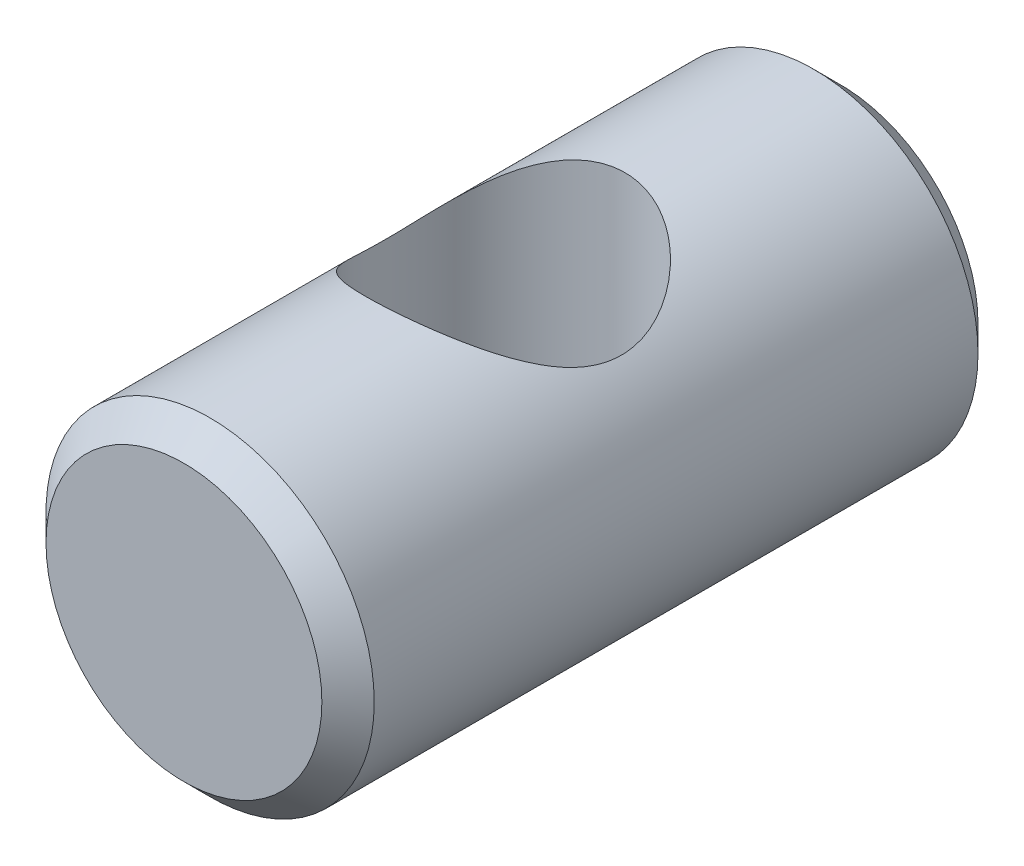
ISO-10303-21;
HEADER;
FILE_DESCRIPTION(('STEP AP214'),'2;1');
FILE_NAME('part.step','',(''),(''),'','','');
FILE_SCHEMA(('AUTOMOTIVE_DESIGN { 1 0 10303 214 1 1 1 1 }'));
ENDSEC;
DATA;
#1=APPLICATION_CONTEXT('core data for automotive mechanical design processes');
#2=APPLICATION_PROTOCOL_DEFINITION('international standard','automotive_design',2000,#1);
#3=PRODUCT_CONTEXT('',#1,'mechanical');
#4=PRODUCT('Part','Part','',(#3));
#5=PRODUCT_RELATED_PRODUCT_CATEGORY('part','',(#4));
#6=PRODUCT_DEFINITION_FORMATION('','',#4);
#7=PRODUCT_DEFINITION_CONTEXT('part definition',#1,'design');
#8=PRODUCT_DEFINITION('design','',#6,#7);
#9=PRODUCT_DEFINITION_SHAPE('','',#8);
#10=(LENGTH_UNIT() NAMED_UNIT(*) SI_UNIT(.MILLI.,.METRE.));
#11=(NAMED_UNIT(*) PLANE_ANGLE_UNIT() SI_UNIT($,.RADIAN.));
#12=(NAMED_UNIT(*) SI_UNIT($,.STERADIAN.) SOLID_ANGLE_UNIT());
#13=UNCERTAINTY_MEASURE_WITH_UNIT(LENGTH_MEASURE(1.E-05),#10,'distance_accuracy_value','');
#14=(GEOMETRIC_REPRESENTATION_CONTEXT(3) GLOBAL_UNCERTAINTY_ASSIGNED_CONTEXT((#13)) GLOBAL_UNIT_ASSIGNED_CONTEXT((#10,
#11,#12)) REPRESENTATION_CONTEXT('',''));
#15=CARTESIAN_POINT('',(0.,0.,0.));
#16=DIRECTION('',(0.,0.,1.));
#17=DIRECTION('',(1.,0.,0.));
#18=AXIS2_PLACEMENT_3D('',#15,#16,#17);
#19=CARTESIAN_POINT('',(0.,0.,9.525));
#20=DIRECTION('',(0.,0.,-1.));
#21=DIRECTION('',(-1.,0.,0.));
#22=AXIS2_PLACEMENT_3D('',#19,#20,#21);
#23=CYLINDRICAL_SURFACE('',#22,4.765);
#24=CARTESIAN_POINT('',(0.,0.,-8.76499999999998));
#25=DIRECTION('',(0.,0.,1.));
#26=DIRECTION('',(1.,0.,0.));
#27=AXIS2_PLACEMENT_3D('',#24,#25,#26);
#28=CIRCLE('',#27,4.765);
#29=CARTESIAN_POINT('',(4.765,0.,-8.76499999999998));
#30=VERTEX_POINT('',#29);
#31=EDGE_CURVE('E47',#30,#30,#28,.T.);
#32=ORIENTED_EDGE('',*,*,#31,.T.);
#33=EDGE_LOOP('',(#32));
#34=FACE_BOUND('',#33,.T.);
#35=CARTESIAN_POINT('',(0.,0.,8.76500000000001));
#36=DIRECTION('',(0.,0.,1.));
#37=DIRECTION('',(1.,0.,0.));
#38=AXIS2_PLACEMENT_3D('',#35,#36,#37);
#39=CIRCLE('',#38,4.765);
#40=CARTESIAN_POINT('',(4.765,0.,8.76500000000001));
#41=VERTEX_POINT('',#40);
#42=EDGE_CURVE('E51',#41,#41,#39,.F.);
#43=ORIENTED_EDGE('',*,*,#42,.T.);
#44=EDGE_LOOP('',(#43));
#45=FACE_BOUND('',#44,.T.);
#46=CARTESIAN_POINT('',(0.,-4.765,-3.42087708051605));
#47=CARTESIAN_POINT('',(-0.0833627581168181,-4.7649997101109,-3.42696899134863));
#48=CARTESIAN_POINT('',(-0.166953392424251,-4.76280757869707,-3.43001003086423));
#49=CARTESIAN_POINT('',(-0.333933182408652,-4.75402028790231,-3.4299899120654));
#50=CARTESIAN_POINT('',(-0.41732223719261,-4.74742325494959,-3.42692615604904));
#51=CARTESIAN_POINT('',(-0.583312250165056,-4.72989865727235,-3.41478160746824));
#52=CARTESIAN_POINT('',(-0.665912068503747,-4.71896558414041,-3.40569315136156));
#53=CARTESIAN_POINT('',(-0.829610597514771,-4.69295834085159,-3.38168739143667));
#54=CARTESIAN_POINT('',(-0.91070865358331,-4.67788240819801,-3.36676760565251));
#55=CARTESIAN_POINT('',(-1.15000632689336,-4.62699847385246,-3.31382161536753));
#56=CARTESIAN_POINT('',(-1.30524951697123,-4.58542013528299,-3.26752778272676));
#57=CARTESIAN_POINT('',(-1.60411463212557,-4.48962808746058,-3.15544383432779));
#58=CARTESIAN_POINT('',(-1.74773682156028,-4.43541466574349,-3.08965416222603));
#59=CARTESIAN_POINT('',(-2.03259497643689,-4.31273538578719,-2.93522566350036));
#60=CARTESIAN_POINT('',(-2.17272279857911,-4.24347672491827,-2.84518090003159));
#61=CARTESIAN_POINT('',(-2.43631552731587,-4.09784606286129,-2.64803347355049));
#62=CARTESIAN_POINT('',(-2.55976291960052,-4.02146672501527,-2.54091313456509));
#63=CARTESIAN_POINT('',(-2.81327393100644,-3.84950291536883,-2.28757037498761));
#64=CARTESIAN_POINT('',(-2.93940806717613,-3.75321839663728,-2.13784494064544));
#65=CARTESIAN_POINT('',(-3.10885207016274,-3.61188607024724,-1.89774924473951));
#66=CARTESIAN_POINT('',(-3.16205944901992,-3.56527135977744,-1.81509327318893));
#67=CARTESIAN_POINT('',(-3.26165283895997,-3.47438917550769,-1.64456461914389));
#68=CARTESIAN_POINT('',(-3.30804141803447,-3.43012082209569,-1.55669391813204));
#69=CARTESIAN_POINT('',(-3.41144333221737,-3.32784018306176,-1.33801732923479));
#70=CARTESIAN_POINT('',(-3.46485738281701,-3.27176419567389,-1.20454764001565));
#71=CARTESIAN_POINT('',(-3.55539465585279,-3.1731532714438,-0.927567219273259));
#72=CARTESIAN_POINT('',(-3.59255605597934,-3.13058666617785,-0.784080947165172));
#73=CARTESIAN_POINT('',(-3.64343651296181,-3.07113542283653,-0.514646140223208));
#74=CARTESIAN_POINT('',(-3.66010628533956,-3.05107413064414,-0.389980532152302));
#75=CARTESIAN_POINT('',(-3.67954153570878,-3.02761567970702,-0.138051441971629));
#76=CARTESIAN_POINT('',(-3.68232117171679,-3.02420155283186,-0.0107907379518645));
#77=CARTESIAN_POINT('',(-3.67376621747767,-3.03458366659267,0.242449329866107));
#78=CARTESIAN_POINT('',(-3.66243797397314,-3.04837216824954,0.36842924415841));
#79=CARTESIAN_POINT('',(-3.62657095184853,-3.09094772918142,0.615927376424318));
#80=CARTESIAN_POINT('',(-3.60201250089043,-3.11975712134959,0.737438661719832));
#81=CARTESIAN_POINT('',(-3.52797021750044,-3.20358122773375,1.02486117239319));
#82=CARTESIAN_POINT('',(-3.47231020523667,-3.26453704351351,1.18741075414518));
#83=CARTESIAN_POINT('',(-3.34017866781708,-3.39961296516166,1.498121783823));
#84=CARTESIAN_POINT('',(-3.2636446149314,-3.47377238661047,1.64623815847782));
#85=CARTESIAN_POINT('',(-3.12200897105521,-3.60054284241464,1.87825971607124));
#86=CARTESIAN_POINT('',(-3.06234750531042,-3.65156363596669,1.9664324955114));
#87=CARTESIAN_POINT('',(-2.93536296354977,-3.75440484501345,2.13658829521524));
#88=CARTESIAN_POINT('',(-2.86803758566651,-3.80622549668558,2.21856944344932));
#89=CARTESIAN_POINT('',(-2.65493557738645,-3.96070606463684,2.4548169203279));
#90=CARTESIAN_POINT('',(-2.4978237985218,-4.06258137631192,2.59972905493882));
#91=CARTESIAN_POINT('',(-2.18575837138568,-4.23718725327564,2.83706621766583));
#92=CARTESIAN_POINT('',(-2.03548298499758,-4.31186637762032,2.93424360521689));
#93=CARTESIAN_POINT('',(-1.71702572980925,-4.44824656330391,3.10568912436018));
#94=CARTESIAN_POINT('',(-1.54887024912961,-4.50996636079322,3.17999040299218));
#95=CARTESIAN_POINT('',(-1.22389848309852,-4.60778480850806,3.29263516387729));
#96=CARTESIAN_POINT('',(-1.06910753325383,-4.64632732736096,3.33468022800881));
#97=CARTESIAN_POINT('',(-0.75219098421797,-4.70801774696666,3.39687013419293));
#98=CARTESIAN_POINT('',(-0.590069112764686,-4.73117337991453,3.4170259792185));
#99=CARTESIAN_POINT('',(-0.262598143568302,-4.7606051003247,3.43390286080123));
#100=CARTESIAN_POINT('',(-0.0972412962651627,-4.76683385814853,3.43055828056669));
#101=CARTESIAN_POINT('',(0.231024129353294,-4.76222706928004,3.40010195996678));
#102=CARTESIAN_POINT('',(0.393932420256087,-4.75138953488968,3.37298745129903));
#103=CARTESIAN_POINT('',(0.705514268669749,-4.71498049061455,3.29795083571309));
#104=CARTESIAN_POINT('',(0.854498752183595,-4.69006694126301,3.25098003249397));
#105=CARTESIAN_POINT('',(1.14256413370517,-4.62833634686259,3.13840780618742));
#106=CARTESIAN_POINT('',(1.28164310390505,-4.59151699239254,3.07280276883643));
#107=CARTESIAN_POINT('',(1.5605913242394,-4.50478911028579,2.91796402171938));
#108=CARTESIAN_POINT('',(1.6992420339739,-4.45396042558585,2.82706121692328));
#109=CARTESIAN_POINT('',(1.96045324775842,-4.34533105232053,2.62789389216064));
#110=CARTESIAN_POINT('',(2.08299871660834,-4.28752394420402,2.51961335554432));
#111=CARTESIAN_POINT('',(2.33061071233595,-4.15886196775128,2.26753986981794));
#112=CARTESIAN_POINT('',(2.4524560274696,-4.08747815085455,2.12084350362776));
#113=CARTESIAN_POINT('',(2.67091966387117,-3.94818744226299,1.80818256348861));
#114=CARTESIAN_POINT('',(2.76753692468302,-3.88028069682256,1.64221717999394));
#115=CARTESIAN_POINT('',(2.91829752704228,-3.76775877390235,1.32363316444147));
#116=CARTESIAN_POINT('',(2.97693831230802,-3.72114907301219,1.17388770573104));
#117=CARTESIAN_POINT('',(3.04915600293589,-3.66180847873486,0.941826581338288));
#118=CARTESIAN_POINT('',(3.0706008978109,-3.64379412637323,0.863255129060429));
#119=CARTESIAN_POINT('',(3.10797188341904,-3.61197174564401,0.703992654043783));
#120=CARTESIAN_POINT('',(3.12390068817333,-3.59816164910817,0.623302694735667));
#121=CARTESIAN_POINT('',(3.15010468685879,-3.57524455910332,0.459495462666012));
#122=CARTESIAN_POINT('',(3.16032158062367,-3.5661861203942,0.376361962516609));
#123=CARTESIAN_POINT('',(3.17464168800661,-3.55344451616001,0.209195138832906));
#124=CARTESIAN_POINT('',(3.17874788699032,-3.54975872585817,0.125162274904951));
#125=CARTESIAN_POINT('',(3.18076053743013,-3.54795587812489,-0.0430393452037699));
#126=CARTESIAN_POINT('',(3.17866722999483,-3.54983860412504,-0.127208095972439));
#127=CARTESIAN_POINT('',(3.16833758034575,-3.55905933774995,-0.294840628996082));
#128=CARTESIAN_POINT('',(3.16010150131517,-3.56639711165655,-0.37830444129877));
#129=CARTESIAN_POINT('',(3.129430196119,-3.59341005189328,-0.604314657609787));
#130=CARTESIAN_POINT('',(3.10101793603989,-3.61818171011667,-0.745494317394037));
#131=CARTESIAN_POINT('',(3.02771937958645,-3.67972750014127,-1.02069983126741));
#132=CARTESIAN_POINT('',(2.98281650470617,-3.71651370639189,-1.15471833017231));
#133=CARTESIAN_POINT('',(2.8560768918245,-3.8153502491925,-1.46853642894097));
#134=CARTESIAN_POINT('',(2.76664814536404,-3.88152734494911,-1.64398166227299));
#135=CARTESIAN_POINT('',(2.56077346334119,-4.02033820070584,-1.97551522842484));
#136=CARTESIAN_POINT('',(2.44428083509273,-4.09298298410994,-2.13156938380249));
#137=CARTESIAN_POINT('',(2.18450650401399,-4.2373970566927,-2.42421216807333));
#138=CARTESIAN_POINT('',(2.04090097393914,-4.30914323590254,-2.56052605726515));
#139=CARTESIAN_POINT('',(1.72973058522059,-4.44318432752427,-2.80802181758103));
#140=CARTESIAN_POINT('',(1.56219804304703,-4.50549175797245,-2.91923707314103));
#141=CARTESIAN_POINT('',(1.23969583506405,-4.60338031575656,-3.09396462152009));
#142=CARTESIAN_POINT('',(1.08834922542923,-4.64178783933997,-3.16252149709776));
#143=CARTESIAN_POINT('',(0.853387810710914,-4.68864069192958,-3.24875451241662));
#144=CARTESIAN_POINT('',(0.773800863355163,-4.70245945854321,-3.27471971164357));
#145=CARTESIAN_POINT('',(0.612411306870991,-4.72618391319332,-3.32087000112459));
#146=CARTESIAN_POINT('',(0.530609679466052,-4.73609130567107,-3.34105760799584));
#147=CARTESIAN_POINT('',(0.374335243630171,-4.75084997254152,-3.37353939001354));
#148=CARTESIAN_POINT('',(0.300030947704153,-4.75613339853629,-3.38645258471521));
#149=CARTESIAN_POINT('',(0.150546671086997,-4.76320900575073,-3.40736829831093));
#150=CARTESIAN_POINT('',(0.0753664637160956,-4.76500026208246,-3.41536951590209));
#151=CARTESIAN_POINT('',(0.,-4.765,-3.42087708051605));
#152=B_SPLINE_CURVE_WITH_KNOTS('',3,(#46,#47,#48,#49,#50,#51,#52,#53,#54,#55,#56,#57,#58,#59,
#60,#61,#62,#63,#64,#65,#66,#67,#68,#69,#70,#71,#72,#73,#74,#75,#76,#77,#78,#79,#80,#81,#82,#83,
#84,#85,#86,#87,#88,#89,#90,#91,#92,#93,#94,#95,#96,#97,#98,#99,#100,#101,#102,#103,#104,#105,
#106,#107,#108,#109,#110,#111,#112,#113,#114,#115,#116,#117,#118,#119,#120,#121,#122,#123,#124,
#125,#126,#127,#128,#129,#130,#131,#132,#133,#134,#135,#136,#137,#138,#139,#140,#141,#142,#143,
#144,#145,#146,#147,#148,#149,#150,#151),.UNSPECIFIED.,.T.,.F.,(4,2,2,2,2,2,2,2,2,2,2,2,2,2,2,2,
2,2,2,2,2,2,2,2,2,2,2,2,2,2,2,2,2,2,2,2,2,2,2,2,2,2,2,2,2,2,2,2,2,2,2,2,4),(0.,
0.250678148817341,0.501462988541287,0.752567445437252,1.00377889552888,1.50309474088369,
2.00239922444642,2.54160992918404,3.08138247258981,3.73300244855075,4.05909733145616,
4.38506908912952,4.84654436743379,5.30692973453839,5.68734604359481,6.06737452056514,
6.44723209503533,6.82765605484285,7.37157480546313,7.91714109472132,8.27090631470675,
8.62477807035776,9.33119791439566,9.91077027397039,10.4894988486046,10.9822712500665,
11.4747958366297,11.9686961727678,12.4626540373564,12.9352342359093,13.4079061579591,
13.9261848288361,14.4449439577641,15.0533142145202,15.6617100398795,16.1619385675779,
16.4119146790501,16.6617676221917,16.9141262556176,17.1663615593023,17.4185870532858,
17.6708017414466,18.1072101440206,18.5440584873629,19.1640002904501,19.7850197135797,
20.4139885307568,21.0421157411608,21.5513660687497,21.8056438515067,22.059810706191,
22.2863833912941,22.5130160751694),.UNSPECIFIED.);
#153=CARTESIAN_POINT('',(0.,-4.765,-3.42087708051605));
#154=VERTEX_POINT('',#153);
#155=EDGE_CURVE('E56',#154,#154,#152,.T.);
#156=ORIENTED_EDGE('',*,*,#155,.T.);
#157=EDGE_LOOP('',(#156));
#158=FACE_BOUND('',#157,.T.);
#159=CARTESIAN_POINT('',(-0.25,4.75843724346555,3.43));
#160=CARTESIAN_POINT('',(-0.422180009069406,4.749390618167,3.42999980483541));
#161=CARTESIAN_POINT('',(-0.59386282730199,4.73091871113112,3.41695856293195));
#162=CARTESIAN_POINT('',(-0.930629104770302,4.67635636796384,3.36610979440147));
#163=CARTESIAN_POINT('',(-1.09570851357914,4.64025529237457,3.32828730721862));
#164=CARTESIAN_POINT('',(-1.41392411864396,4.55336447971862,3.23075051942857));
#165=CARTESIAN_POINT('',(-1.56712334101048,4.5026601113221,3.17116292636266));
#166=CARTESIAN_POINT('',(-1.85998836726663,4.38979766700268,3.03299834240104));
#167=CARTESIAN_POINT('',(-1.99965414606241,4.32763956984278,2.95442131629586));
#168=CARTESIAN_POINT('',(-2.27820698899914,4.18828982189439,2.77162910883962));
#169=CARTESIAN_POINT('',(-2.41542819149111,4.11020218068904,2.66557505303866));
#170=CARTESIAN_POINT('',(-2.67111072919315,3.94883137284482,2.43572487373919));
#171=CARTESIAN_POINT('',(-2.78953546002452,3.86553849846079,2.31189500490524));
#172=CARTESIAN_POINT('',(-2.96344629098399,3.732292646302,2.10063521621267));
#173=CARTESIAN_POINT('',(-3.02522112465854,3.68226630299909,2.01833701427756));
#174=CARTESIAN_POINT('',(-3.14150590868554,3.58357003530251,1.84790207991889));
#175=CARTESIAN_POINT('',(-3.1960131207988,3.5349006275963,1.7597631654945));
#176=CARTESIAN_POINT('',(-3.29731229261899,3.44060115304685,1.57784833521894));
#177=CARTESIAN_POINT('',(-3.34411822611588,3.39496567295495,1.48408305992192));
#178=CARTESIAN_POINT('',(-3.42959137880208,3.30859742398811,1.29083456033671));
#179=CARTESIAN_POINT('',(-3.46826509160405,3.2678607546062,1.19135597958454));
#180=CARTESIAN_POINT('',(-3.54347659526858,3.18632211811376,0.966712328692859));
#181=CARTESIAN_POINT('',(-3.57812346664731,3.14705996480953,0.840323998552467));
#182=CARTESIAN_POINT('',(-3.63302442402354,3.08352956814293,0.58097620836193));
#183=CARTESIAN_POINT('',(-3.65331272726122,3.05922569654857,0.448033183521055));
#184=CARTESIAN_POINT('',(-3.67812283683354,3.02936636632518,0.177337549423229));
#185=CARTESIAN_POINT('',(-3.68251233934075,3.02396824643502,0.0395541719109326));
#186=CARTESIAN_POINT('',(-3.67470644643728,3.03344305810687,-0.23487587460697));
#187=CARTESIAN_POINT('',(-3.66249943392474,3.04833018879986,-0.371521679960182));
#188=CARTESIAN_POINT('',(-3.62015799382368,3.09852315491188,-0.655828380639311));
#189=CARTESIAN_POINT('',(-3.58799174144691,3.13612809889826,-0.802759414360213));
#190=CARTESIAN_POINT('',(-3.50660899556505,3.22685391573892,-1.08690765852794));
#191=CARTESIAN_POINT('',(-3.45734815065714,3.28001509196861,-1.22409847190397));
#192=CARTESIAN_POINT('',(-3.35999029035731,3.37921222953507,-1.45031682658415));
#193=CARTESIAN_POINT('',(-3.31552748835514,3.42299124550292,-1.54196683547208));
#194=CARTESIAN_POINT('',(-3.21937168211258,3.51357799533849,-1.7198719105116));
#195=CARTESIAN_POINT('',(-3.16767569861283,3.56038697291962,-1.80612473233374));
#196=CARTESIAN_POINT('',(-3.05733519065029,3.65557723444101,-1.97327341136436));
#197=CARTESIAN_POINT('',(-2.99868376029761,3.70396004583247,-2.05416381804876));
#198=CARTESIAN_POINT('',(-2.87465956601933,3.80102084509467,-2.21043246978884));
#199=CARTESIAN_POINT('',(-2.80928649472037,3.84969884636826,-2.28581046249784));
#200=CARTESIAN_POINT('',(-2.6702557671566,3.94744940552613,-2.43263894546763));
#201=CARTESIAN_POINT('',(-2.59643405525365,3.99650228404324,-2.50394748039488));
#202=CARTESIAN_POINT('',(-2.44198609531555,4.09270177982323,-2.64020867362414));
#203=CARTESIAN_POINT('',(-2.36135999487914,4.13984843840248,-2.70516146972696));
#204=CARTESIAN_POINT('',(-2.19361254846785,4.2311207520192,-2.82808330517596));
#205=CARTESIAN_POINT('',(-2.10650409604225,4.27525208591359,-2.88606563800174));
#206=CARTESIAN_POINT('',(-1.92594548966524,4.3595756679867,-2.99452956360935));
#207=CARTESIAN_POINT('',(-1.83249514460759,4.39976779737237,-3.04501093021117));
#208=CARTESIAN_POINT('',(-1.58991791011193,4.49465680101692,-3.16160717844564));
#209=CARTESIAN_POINT('',(-1.43688887677842,4.54617300319559,-3.22239703143537));
#210=CARTESIAN_POINT('',(-1.11985321098478,4.63445714602499,-3.3220213557935));
#211=CARTESIAN_POINT('',(-0.955854490731871,4.67123558567514,-3.36087146486794));
#212=CARTESIAN_POINT('',(-0.620041304864633,4.72756501903715,-3.41423360193657));
#213=CARTESIAN_POINT('',(-0.448189976813921,4.74702354164412,-3.42861536060857));
#214=CARTESIAN_POINT('',(-0.103195532056556,4.76701209164517,-3.43119218349009));
#215=CARTESIAN_POINT('',(0.06994727139145,4.76754656888776,-3.41939340455174));
#216=CARTESIAN_POINT('',(0.396800733953036,4.75102741592386,-3.37216085402572));
#217=CARTESIAN_POINT('',(0.550903795546914,4.73547935394817,-3.33884247322146));
#218=CARTESIAN_POINT('',(0.851262679297082,4.69080460019725,-3.25216372524372));
#219=CARTESIAN_POINT('',(0.997516834516372,4.66167503663273,-3.19879911978833));
#220=CARTESIAN_POINT('',(1.28614476637547,4.59066745677348,-3.0710403225626));
#221=CARTESIAN_POINT('',(1.42797966766526,4.5482360225696,-2.99574591149816));
#222=CARTESIAN_POINT('',(1.69771873358212,4.45459184021555,-2.82781924377908));
#223=CARTESIAN_POINT('',(1.82561916137349,4.40337674596602,-2.73518235437366));
#224=CARTESIAN_POINT('',(2.08559098582612,4.28706511495821,-2.51852707855975));
#225=CARTESIAN_POINT('',(2.2150420244168,4.22105957781513,-2.39185853378127));
#226=CARTESIAN_POINT('',(2.4525288591269,4.08765163666692,-2.11988296233599));
#227=CARTESIAN_POINT('',(2.56051870491995,4.02024656957631,-1.97453701758846));
#228=CARTESIAN_POINT('',(2.71141297716131,3.91890470250436,-1.73364032653499));
#229=CARTESIAN_POINT('',(2.76225962831151,3.88310759046257,-1.64375989611526));
#230=CARTESIAN_POINT('',(2.85606768069206,3.81463871939836,-1.45876664530863));
#231=CARTESIAN_POINT('',(2.8990272649147,3.78196768138302,-1.36365262576038));
#232=CARTESIAN_POINT('',(2.97638382467227,3.7213945324715,-1.16888238761678));
#233=CARTESIAN_POINT('',(3.01080676435227,3.6934780438477,-1.06924106056855));
#234=CARTESIAN_POINT('',(3.07061216797024,3.64390866973889,-0.865836413850729));
#235=CARTESIAN_POINT('',(3.09600079900905,3.62225151334222,-0.762075960014789));
#236=CARTESIAN_POINT('',(3.14431905107756,3.58048576732931,-0.514276109849917));
#237=CARTESIAN_POINT('',(3.1632690781055,3.56357947310397,-0.368863877264377));
#238=CARTESIAN_POINT('',(3.18229415057448,3.54660528363274,-0.0759553160984811));
#239=CARTESIAN_POINT('',(3.18238833621042,3.54652031339164,0.0715387471135857));
#240=CARTESIAN_POINT('',(3.16376347579515,3.56313911837428,0.364127843469745));
#241=CARTESIAN_POINT('',(3.14506985693007,3.57982020262542,0.509225849632988));
#242=CARTESIAN_POINT('',(3.09006178812862,3.6274007096972,0.793694678976371));
#243=CARTESIAN_POINT('',(3.05372153995533,3.65832094581284,0.93305679207045));
#244=CARTESIAN_POINT('',(2.94995679839854,3.74283457822027,1.249627259653));
#245=CARTESIAN_POINT('',(2.8761691317453,3.80056128592335,1.42363336901505));
#246=CARTESIAN_POINT('',(2.70309172031867,3.92554694052951,1.75476054116614));
#247=CARTESIAN_POINT('',(2.60375916203549,3.99282180458683,1.91185262262683));
#248=CARTESIAN_POINT('',(2.37965965281677,4.1303821812455,2.21024978907531));
#249=CARTESIAN_POINT('',(2.25446848393284,4.20070005001654,2.35122119961122));
#250=CARTESIAN_POINT('',(1.98132226028617,4.33621841215064,2.61183089931649));
#251=CARTESIAN_POINT('',(1.83339056066264,4.40142405331531,2.73149080683867));
#252=CARTESIAN_POINT('',(1.53413492006617,4.51378899534322,2.93439863762913));
#253=CARTESIAN_POINT('',(1.38501302638155,4.56214832085995,3.02021473285691));
#254=CARTESIAN_POINT('',(1.07249564524744,4.64554146755817,3.16951406225263));
#255=CARTESIAN_POINT('',(0.909111289256097,4.68058556855773,3.23301452201411));
#256=CARTESIAN_POINT('',(0.581478494873652,4.73212589223905,3.33183530764178));
#257=CARTESIAN_POINT('',(0.417802064196764,4.74955942472212,3.36854686433097));
#258=CARTESIAN_POINT('',(0.0859254534274394,4.76711849433294,3.41762518536938));
#259=CARTESIAN_POINT('',(-0.0822731758795966,4.76724989098796,3.43000019011694));
#260=CARTESIAN_POINT('',(-0.25,4.75843724346555,3.43));
#261=B_SPLINE_CURVE_WITH_KNOTS('',3,(#159,#160,#161,#162,#163,#164,#165,#166,#167,#168,#169,
#170,#171,#172,#173,#174,#175,#176,#177,#178,#179,#180,#181,#182,#183,#184,#185,#186,#187,#188,
#189,#190,#191,#192,#193,#194,#195,#196,#197,#198,#199,#200,#201,#202,#203,#204,#205,#206,#207,
#208,#209,#210,#211,#212,#213,#214,#215,#216,#217,#218,#219,#220,#221,#222,#223,#224,#225,#226,
#227,#228,#229,#230,#231,#232,#233,#234,#235,#236,#237,#238,#239,#240,#241,#242,#243,#244,#245,
#246,#247,#248,#249,#250,#251,#252,#253,#254,#255,#256,#257,#258,#259,#260),.UNSPECIFIED.,.T.,
.F.,(4,2,2,2,2,2,2,2,2,2,2,2,2,2,2,2,2,2,2,2,2,2,2,2,2,2,2,2,2,2,2,2,2,2,2,2,2,2,2,2,2,2,2,2,2,
2,2,2,2,2,4),(0.,0.516551025096824,1.03341418220019,1.54731512007828,2.06121701081903,
2.62982932183038,3.19953571462131,3.54246459279583,3.88552231417978,4.22795053195656,
4.57010427222594,4.97905439316964,5.38702665221779,5.79838620186915,6.21003384012951,
6.67262967068467,7.1364347778277,7.46866532411958,7.80103311718076,8.13373371721725,
8.46644953806418,8.80733809568013,9.14821926074384,9.48843965067855,9.82867029735157,
10.3440014803113,10.8589648922706,11.3766614843259,11.8942363430695,12.3673901670618,
12.8406440841658,13.3370245096255,13.8335377244494,14.4096746680997,14.9870321881218,
15.3145391492316,15.6421214663625,15.968694875667,16.2950449261748,16.7357599059526,
17.1760275223247,17.6157000871626,18.0560173690192,18.6457302885718,19.2364380888803,
19.8377403374759,20.4384291081866,20.9723943239786,21.5059464582794,22.0093081125728,
22.5124992983782),.UNSPECIFIED.);
#262=CARTESIAN_POINT('',(-0.25,4.75843724346555,3.43));
#263=VERTEX_POINT('',#262);
#264=EDGE_CURVE('E64',#263,#263,#261,.T.);
#265=ORIENTED_EDGE('',*,*,#264,.T.);
#266=EDGE_LOOP('',(#265));
#267=FACE_BOUND('',#266,.T.);
#268=ADVANCED_FACE('F35',(#34,#45,#158,#267),#23,.T.);
#269=CARTESIAN_POINT('',(0.,0.,9.525));
#270=DIRECTION('',(0.,0.,1.));
#271=DIRECTION('',(1.,0.,0.));
#272=AXIS2_PLACEMENT_3D('',#269,#270,#271);
#273=PLANE('',#272);
#274=CARTESIAN_POINT('',(0.,0.,9.525));
#275=DIRECTION('',(0.,0.,1.));
#276=DIRECTION('',(1.,0.,0.));
#277=AXIS2_PLACEMENT_3D('',#274,#275,#276);
#278=CIRCLE('',#277,4.00500000000001);
#279=CARTESIAN_POINT('',(4.00500000000001,0.,9.525));
#280=VERTEX_POINT('',#279);
#281=EDGE_CURVE('E10',#280,#280,#278,.T.);
#282=ORIENTED_EDGE('',*,*,#281,.T.);
#283=EDGE_LOOP('',(#282));
#284=FACE_BOUND('',#283,.T.);
#285=ADVANCED_FACE('F77',(#284),#273,.T.);
#286=CARTESIAN_POINT('',(0.,0.,-9.525));
#287=DIRECTION('',(0.,0.,1.));
#288=DIRECTION('',(1.,0.,0.));
#289=AXIS2_PLACEMENT_3D('',#286,#287,#288);
#290=PLANE('',#289);
#291=CARTESIAN_POINT('',(0.,0.,-9.525));
#292=DIRECTION('',(0.,0.,1.));
#293=DIRECTION('',(1.,0.,0.));
#294=AXIS2_PLACEMENT_3D('',#291,#292,#293);
#295=CIRCLE('',#294,4.00499999999998);
#296=CARTESIAN_POINT('',(4.00499999999998,0.,-9.525));
#297=VERTEX_POINT('',#296);
#298=EDGE_CURVE('E43',#297,#297,#295,.F.);
#299=ORIENTED_EDGE('',*,*,#298,.T.);
#300=EDGE_LOOP('',(#299));
#301=FACE_BOUND('',#300,.T.);
#302=ADVANCED_FACE('F75',(#301),#290,.F.);
#303=CARTESIAN_POINT('',(-0.25,-4.765,0.));
#304=DIRECTION('',(0.,1.,0.));
#305=DIRECTION('',(0.,0.,1.));
#306=AXIS2_PLACEMENT_3D('',#303,#304,#305);
#307=CYLINDRICAL_SURFACE('',#306,3.43);
#308=ORIENTED_EDGE('',*,*,#264,.F.);
#309=EDGE_LOOP('',(#308));
#310=FACE_BOUND('',#309,.T.);
#311=ORIENTED_EDGE('',*,*,#155,.F.);
#312=EDGE_LOOP('',(#311));
#313=FACE_BOUND('',#312,.T.);
#314=ADVANCED_FACE('F70',(#310,#313),#307,.F.);
#315=CARTESIAN_POINT('',(0.,0.,-8.76499999999998));
#316=DIRECTION('',(0.,0.,1.));
#317=DIRECTION('',(1.,0.,0.));
#318=AXIS2_PLACEMENT_3D('',#315,#316,#317);
#319=CONICAL_SURFACE('',#318,4.765,0.785398163397451);
#320=CARTESIAN_POINT('',(4.00499999999998,0.,-9.525));
#321=CARTESIAN_POINT('',(4.01291666666664,0.,-9.51708333333333));
#322=CARTESIAN_POINT('',(4.02083333333331,0.,-9.50916666666667));
#323=CARTESIAN_POINT('',(4.03666666666664,0.,-9.49333333333333));
#324=CARTESIAN_POINT('',(4.04458333333331,0.,-9.48541666666667));
#325=CARTESIAN_POINT('',(4.06041666666665,0.,-9.46958333333333));
#326=CARTESIAN_POINT('',(4.06833333333331,0.,-9.46166666666666));
#327=CARTESIAN_POINT('',(4.08416666666665,0.,-9.44583333333333));
#328=CARTESIAN_POINT('',(4.09208333333331,0.,-9.43791666666667));
#329=CARTESIAN_POINT('',(4.10791666666665,0.,-9.42208333333333));
#330=CARTESIAN_POINT('',(4.11583333333331,0.,-9.41416666666666));
#331=CARTESIAN_POINT('',(4.13166666666665,0.,-9.39833333333333));
#332=CARTESIAN_POINT('',(4.13958333333331,0.,-9.39041666666666));
#333=CARTESIAN_POINT('',(4.15541666666665,0.,-9.37458333333333));
#334=CARTESIAN_POINT('',(4.16333333333332,0.,-9.36666666666666));
#335=CARTESIAN_POINT('',(4.17916666666665,0.,-9.35083333333333));
#336=CARTESIAN_POINT('',(4.18708333333332,0.,-9.34291666666666));
#337=CARTESIAN_POINT('',(4.20291666666665,0.,-9.32708333333333));
#338=CARTESIAN_POINT('',(4.21083333333332,0.,-9.31916666666666));
#339=CARTESIAN_POINT('',(4.22666666666665,0.,-9.30333333333333));
#340=CARTESIAN_POINT('',(4.23458333333332,0.,-9.29541666666666));
#341=CARTESIAN_POINT('',(4.25041666666665,0.,-9.27958333333333));
#342=CARTESIAN_POINT('',(4.25833333333332,0.,-9.27166666666666));
#343=CARTESIAN_POINT('',(4.27416666666665,0.,-9.25583333333333));
#344=CARTESIAN_POINT('',(4.28208333333332,0.,-9.24791666666666));
#345=CARTESIAN_POINT('',(4.29791666666665,0.,-9.23208333333333));
#346=CARTESIAN_POINT('',(4.30583333333332,0.,-9.22416666666666));
#347=CARTESIAN_POINT('',(4.32166666666665,0.,-9.20833333333333));
#348=CARTESIAN_POINT('',(4.32958333333332,0.,-9.20041666666666));
#349=CARTESIAN_POINT('',(4.34541666666665,0.,-9.18458333333333));
#350=CARTESIAN_POINT('',(4.35333333333332,0.,-9.17666666666666));
#351=CARTESIAN_POINT('',(4.36916666666666,0.,-9.16083333333332));
#352=CARTESIAN_POINT('',(4.37708333333332,0.,-9.15291666666666));
#353=CARTESIAN_POINT('',(4.39291666666666,0.,-9.13708333333332));
#354=CARTESIAN_POINT('',(4.40083333333332,0.,-9.12916666666666));
#355=CARTESIAN_POINT('',(4.41666666666666,0.,-9.11333333333332));
#356=CARTESIAN_POINT('',(4.42458333333332,0.,-9.10541666666666));
#357=CARTESIAN_POINT('',(4.44041666666666,0.,-9.08958333333332));
#358=CARTESIAN_POINT('',(4.44833333333332,0.,-9.08166666666665));
#359=CARTESIAN_POINT('',(4.46416666666666,0.,-9.06583333333332));
#360=CARTESIAN_POINT('',(4.47208333333332,0.,-9.05791666666665));
#361=CARTESIAN_POINT('',(4.48791666666666,0.,-9.04208333333332));
#362=CARTESIAN_POINT('',(4.49583333333333,0.,-9.03416666666665));
#363=CARTESIAN_POINT('',(4.51166666666666,0.,-9.01833333333332));
#364=CARTESIAN_POINT('',(4.51958333333333,0.,-9.01041666666665));
#365=CARTESIAN_POINT('',(4.53541666666666,0.,-8.99458333333332));
#366=CARTESIAN_POINT('',(4.54333333333333,0.,-8.98666666666665));
#367=CARTESIAN_POINT('',(4.55916666666666,0.,-8.97083333333332));
#368=CARTESIAN_POINT('',(4.56708333333333,0.,-8.96291666666665));
#369=CARTESIAN_POINT('',(4.58291666666666,0.,-8.94708333333332));
#370=CARTESIAN_POINT('',(4.59083333333333,0.,-8.93916666666665));
#371=CARTESIAN_POINT('',(4.60666666666666,0.,-8.92333333333332));
#372=CARTESIAN_POINT('',(4.61458333333333,0.,-8.91541666666665));
#373=CARTESIAN_POINT('',(4.63041666666666,0.,-8.89958333333332));
#374=CARTESIAN_POINT('',(4.63833333333333,0.,-8.89166666666665));
#375=CARTESIAN_POINT('',(4.65416666666666,0.,-8.87583333333332));
#376=CARTESIAN_POINT('',(4.66208333333333,0.,-8.86791666666665));
#377=CARTESIAN_POINT('',(4.67791666666667,0.,-8.85208333333332));
#378=CARTESIAN_POINT('',(4.68583333333333,0.,-8.84416666666665));
#379=CARTESIAN_POINT('',(4.70166666666667,0.,-8.82833333333332));
#380=CARTESIAN_POINT('',(4.70958333333333,0.,-8.82041666666665));
#381=CARTESIAN_POINT('',(4.72541666666667,0.,-8.80458333333332));
#382=CARTESIAN_POINT('',(4.73333333333333,0.,-8.79666666666665));
#383=CARTESIAN_POINT('',(4.74916666666667,0.,-8.78083333333331));
#384=CARTESIAN_POINT('',(4.75708333333333,0.,-8.77291666666665));
#385=CARTESIAN_POINT('',(4.765,0.,-8.76499999999998));
#386=B_SPLINE_CURVE_WITH_KNOTS('',3,(#320,#321,#322,#323,#324,#325,#326,#327,#328,#329,#330,
#331,#332,#333,#334,#335,#336,#337,#338,#339,#340,#341,#342,#343,#344,#345,#346,#347,#348,#349,
#350,#351,#352,#353,#354,#355,#356,#357,#358,#359,#360,#361,#362,#363,#364,#365,#366,#367,#368,
#369,#370,#371,#372,#373,#374,#375,#376,#377,#378,#379,#380,#381,#382,#383,#384,#385),
.UNSPECIFIED.,.F.,.F.,(4,2,2,2,2,2,2,2,2,2,2,2,2,2,2,2,2,2,2,2,2,2,2,2,2,2,2,2,2,2,2,2,4),(0.,
0.0335875721063609,0.0671751442127236,0.100762716319086,0.134350288425447,0.167937860531809,
0.201525432638172,0.235113004744533,0.268700576850895,0.302288148957258,0.335875721063619,
0.369463293169981,0.403050865276344,0.436638437382705,0.470226009489067,0.503813581595429,
0.537401153701792,0.570988725808153,0.604576297914516,0.638163870020878,0.671751442127239,
0.705339014233602,0.738926586339964,0.772514158446325,0.806101730552688,0.83968930265905,
0.873276874765411,0.906864446871773,0.940452018978136,0.974039591084497,1.00762716319086,
1.04121473529722,1.07480230740358),.UNSPECIFIED.);
#387=EDGE_CURVE('BSEAM74',#297,#30,#386,.T.);
#388=ORIENTED_EDGE('',*,*,#298,.F.);
#389=ORIENTED_EDGE('',*,*,#31,.F.);
#390=ORIENTED_EDGE('',*,*,#387,.T.);
#391=ORIENTED_EDGE('',*,*,#387,.F.);
#392=EDGE_LOOP('',(#388,#390,#389,#391));
#393=FACE_BOUND('',#392,.T.);
#394=ADVANCED_FACE('F74',(#393),#319,.T.);
#395=CARTESIAN_POINT('',(0.,0.,9.525));
#396=DIRECTION('',(0.,0.,-1.));
#397=DIRECTION('',(-1.,0.,0.));
#398=AXIS2_PLACEMENT_3D('',#395,#396,#397);
#399=CONICAL_SURFACE('',#398,4.00500000000001,0.785398163397448);
#400=ORIENTED_EDGE('',*,*,#42,.F.);
#401=EDGE_LOOP('',(#400));
#402=FACE_BOUND('',#401,.T.);
#403=ORIENTED_EDGE('',*,*,#281,.F.);
#404=EDGE_LOOP('',(#403));
#405=FACE_BOUND('',#404,.T.);
#406=ADVANCED_FACE('F38',(#402,#405),#399,.T.);
#407=CLOSED_SHELL('',(#268,#285,#302,#314,#394,#406));
#408=MANIFOLD_SOLID_BREP('B2',#407);
#409=ADVANCED_BREP_SHAPE_REPRESENTATION('',(#18,#408),#14);
#410=SHAPE_DEFINITION_REPRESENTATION(#9,#409);
ENDSEC;
END-ISO-10303-21;
